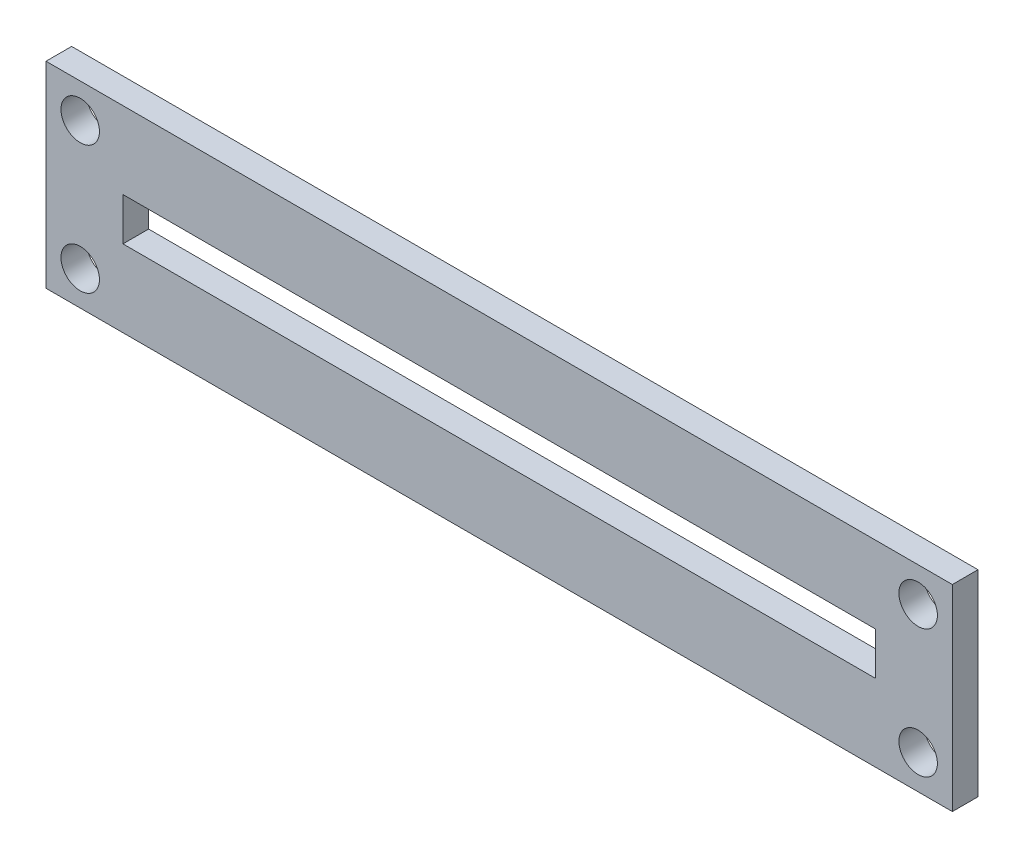
ISO-10303-21;
HEADER;
FILE_DESCRIPTION(('STEP AP214'),'2;1');
FILE_NAME('part.step','',(''),(''),'','','');
FILE_SCHEMA(('AUTOMOTIVE_DESIGN { 1 0 10303 214 1 1 1 1 }'));
ENDSEC;
DATA;
#1=APPLICATION_CONTEXT('core data for automotive mechanical design processes');
#2=APPLICATION_PROTOCOL_DEFINITION('international standard','automotive_design',2000,#1);
#3=PRODUCT_CONTEXT('',#1,'mechanical');
#4=PRODUCT('Part','Part','',(#3));
#5=PRODUCT_RELATED_PRODUCT_CATEGORY('part','',(#4));
#6=PRODUCT_DEFINITION_FORMATION('','',#4);
#7=PRODUCT_DEFINITION_CONTEXT('part definition',#1,'design');
#8=PRODUCT_DEFINITION('design','',#6,#7);
#9=PRODUCT_DEFINITION_SHAPE('','',#8);
#10=(LENGTH_UNIT() NAMED_UNIT(*) SI_UNIT(.MILLI.,.METRE.));
#11=(NAMED_UNIT(*) PLANE_ANGLE_UNIT() SI_UNIT($,.RADIAN.));
#12=(NAMED_UNIT(*) SI_UNIT($,.STERADIAN.) SOLID_ANGLE_UNIT());
#13=UNCERTAINTY_MEASURE_WITH_UNIT(LENGTH_MEASURE(1.E-05),#10,'distance_accuracy_value','');
#14=(GEOMETRIC_REPRESENTATION_CONTEXT(3) GLOBAL_UNCERTAINTY_ASSIGNED_CONTEXT((#13)) GLOBAL_UNIT_ASSIGNED_CONTEXT((#10,
#11,#12)) REPRESENTATION_CONTEXT('',''));
#15=CARTESIAN_POINT('',(0.,0.,0.));
#16=DIRECTION('',(0.,0.,1.));
#17=DIRECTION('',(1.,0.,0.));
#18=AXIS2_PLACEMENT_3D('',#15,#16,#17);
#19=CARTESIAN_POINT('',(0.,0.,3.));
#20=DIRECTION('',(0.,0.,1.));
#21=DIRECTION('',(1.,0.,0.));
#22=AXIS2_PLACEMENT_3D('',#19,#20,#21);
#23=PLANE('',#22);
#24=CARTESIAN_POINT('',(49.,7.5,3.));
#25=DIRECTION('',(0.,0.,1.));
#26=DIRECTION('',(1.,0.,0.));
#27=AXIS2_PLACEMENT_3D('',#24,#25,#26);
#28=CIRCLE('',#27,2.25);
#29=CARTESIAN_POINT('',(51.25,7.5,3.));
#30=VERTEX_POINT('',#29);
#31=EDGE_CURVE('E285',#30,#30,#28,.T.);
#32=ORIENTED_EDGE('',*,*,#31,.F.);
#33=EDGE_LOOP('',(#32));
#34=FACE_BOUND('',#33,.T.);
#35=CARTESIAN_POINT('',(-49.,7.5,3.));
#36=DIRECTION('',(0.,0.,1.));
#37=DIRECTION('',(1.,0.,0.));
#38=AXIS2_PLACEMENT_3D('',#35,#36,#37);
#39=CIRCLE('',#38,2.25);
#40=CARTESIAN_POINT('',(-46.75,7.5,3.));
#41=VERTEX_POINT('',#40);
#42=EDGE_CURVE('E148',#41,#41,#39,.T.);
#43=ORIENTED_EDGE('',*,*,#42,.F.);
#44=EDGE_LOOP('',(#43));
#45=FACE_BOUND('',#44,.T.);
#46=DIRECTION('',(0.,-1.,0.));
#47=VECTOR('',#46,1.);
#48=CARTESIAN_POINT('',(-53.,11.5,3.));
#49=LINE('',#48,#47);
#50=CARTESIAN_POINT('',(-53.,11.5,3.));
#51=VERTEX_POINT('',#50);
#52=CARTESIAN_POINT('',(-53.,-11.5,3.));
#53=VERTEX_POINT('',#52);
#54=EDGE_CURVE('E164',#51,#53,#49,.T.);
#55=ORIENTED_EDGE('',*,*,#54,.T.);
#56=DIRECTION('',(1.,0.,0.));
#57=VECTOR('',#56,1.);
#58=CARTESIAN_POINT('',(-53.,-11.5,3.));
#59=LINE('',#58,#57);
#60=CARTESIAN_POINT('',(53.,-11.5,3.));
#61=VERTEX_POINT('',#60);
#62=EDGE_CURVE('E168',#53,#61,#59,.T.);
#63=ORIENTED_EDGE('',*,*,#62,.T.);
#64=DIRECTION('',(0.,1.,0.));
#65=VECTOR('',#64,1.);
#66=CARTESIAN_POINT('',(53.,11.5,3.));
#67=LINE('',#66,#65);
#68=CARTESIAN_POINT('',(53.,11.5,3.));
#69=VERTEX_POINT('',#68);
#70=EDGE_CURVE('E172',#61,#69,#67,.T.);
#71=ORIENTED_EDGE('',*,*,#70,.T.);
#72=DIRECTION('',(-1.,0.,0.));
#73=VECTOR('',#72,1.);
#74=CARTESIAN_POINT('',(-53.,11.5,3.));
#75=LINE('',#74,#73);
#76=EDGE_CURVE('E175',#69,#51,#75,.T.);
#77=ORIENTED_EDGE('',*,*,#76,.T.);
#78=EDGE_LOOP('',(#55,#63,#71,#77));
#79=FACE_BOUND('',#78,.T.);
#80=DIRECTION('',(0.,-1.,0.));
#81=VECTOR('',#80,1.);
#82=CARTESIAN_POINT('',(-44.,2.50000000000001,3.));
#83=LINE('',#82,#81);
#84=CARTESIAN_POINT('',(-44.,2.50000000000001,3.));
#85=VERTEX_POINT('',#84);
#86=CARTESIAN_POINT('',(-44.,-2.5,3.));
#87=VERTEX_POINT('',#86);
#88=EDGE_CURVE('E122',#85,#87,#83,.T.);
#89=ORIENTED_EDGE('',*,*,#88,.F.);
#90=DIRECTION('',(-1.,0.,0.));
#91=VECTOR('',#90,1.);
#92=CARTESIAN_POINT('',(-44.,2.50000000000001,3.));
#93=LINE('',#92,#91);
#94=CARTESIAN_POINT('',(44.,2.50000000000001,3.));
#95=VERTEX_POINT('',#94);
#96=EDGE_CURVE('E113',#95,#85,#93,.T.);
#97=ORIENTED_EDGE('',*,*,#96,.F.);
#98=DIRECTION('',(0.,1.,0.));
#99=VECTOR('',#98,1.);
#100=CARTESIAN_POINT('',(44.,2.50000000000001,3.));
#101=LINE('',#100,#99);
#102=CARTESIAN_POINT('',(44.,-2.5,3.));
#103=VERTEX_POINT('',#102);
#104=EDGE_CURVE('E140',#103,#95,#101,.T.);
#105=ORIENTED_EDGE('',*,*,#104,.F.);
#106=DIRECTION('',(1.,0.,0.));
#107=VECTOR('',#106,1.);
#108=CARTESIAN_POINT('',(-44.,-2.5,3.));
#109=LINE('',#108,#107);
#110=EDGE_CURVE('E136',#87,#103,#109,.T.);
#111=ORIENTED_EDGE('',*,*,#110,.F.);
#112=EDGE_LOOP('',(#89,#97,#105,#111));
#113=FACE_BOUND('',#112,.T.);
#114=CARTESIAN_POINT('',(-49.,-7.5,3.));
#115=DIRECTION('',(0.,0.,1.));
#116=DIRECTION('',(1.,0.,0.));
#117=AXIS2_PLACEMENT_3D('',#114,#115,#116);
#118=CIRCLE('',#117,2.25);
#119=CARTESIAN_POINT('',(-46.75,-7.5,3.));
#120=VERTEX_POINT('',#119);
#121=EDGE_CURVE('E293',#120,#120,#118,.T.);
#122=ORIENTED_EDGE('',*,*,#121,.F.);
#123=EDGE_LOOP('',(#122));
#124=FACE_BOUND('',#123,.T.);
#125=CARTESIAN_POINT('',(49.,-7.5,3.));
#126=DIRECTION('',(0.,0.,1.));
#127=DIRECTION('',(1.,0.,0.));
#128=AXIS2_PLACEMENT_3D('',#125,#126,#127);
#129=CIRCLE('',#128,2.25);
#130=CARTESIAN_POINT('',(51.25,-7.5,3.));
#131=VERTEX_POINT('',#130);
#132=EDGE_CURVE('E274',#131,#131,#129,.T.);
#133=ORIENTED_EDGE('',*,*,#132,.F.);
#134=EDGE_LOOP('',(#133));
#135=FACE_BOUND('',#134,.T.);
#136=ADVANCED_FACE('F47',(#34,#45,#79,#113,#124,#135),#23,.T.);
#137=CARTESIAN_POINT('',(0.,0.,0.));
#138=DIRECTION('',(0.,0.,1.));
#139=DIRECTION('',(1.,0.,0.));
#140=AXIS2_PLACEMENT_3D('',#137,#138,#139);
#141=PLANE('',#140);
#142=DIRECTION('',(0.,-1.,0.));
#143=VECTOR('',#142,1.);
#144=CARTESIAN_POINT('',(-53.,11.5,0.));
#145=LINE('',#144,#143);
#146=CARTESIAN_POINT('',(-53.,11.5,0.));
#147=VERTEX_POINT('',#146);
#148=CARTESIAN_POINT('',(-53.,-11.5,0.));
#149=VERTEX_POINT('',#148);
#150=EDGE_CURVE('E131',#147,#149,#145,.T.);
#151=ORIENTED_EDGE('',*,*,#150,.F.);
#152=DIRECTION('',(-1.,0.,0.));
#153=VECTOR('',#152,1.);
#154=CARTESIAN_POINT('',(-53.,11.5,0.));
#155=LINE('',#154,#153);
#156=CARTESIAN_POINT('',(53.,11.5,0.));
#157=VERTEX_POINT('',#156);
#158=EDGE_CURVE('E169',#157,#147,#155,.T.);
#159=ORIENTED_EDGE('',*,*,#158,.F.);
#160=DIRECTION('',(0.,1.,0.));
#161=VECTOR('',#160,1.);
#162=CARTESIAN_POINT('',(53.,11.5,0.));
#163=LINE('',#162,#161);
#164=CARTESIAN_POINT('',(53.,-11.5,0.));
#165=VERTEX_POINT('',#164);
#166=EDGE_CURVE('E185',#165,#157,#163,.T.);
#167=ORIENTED_EDGE('',*,*,#166,.F.);
#168=DIRECTION('',(1.,0.,0.));
#169=VECTOR('',#168,1.);
#170=CARTESIAN_POINT('',(-53.,-11.5,0.));
#171=LINE('',#170,#169);
#172=EDGE_CURVE('E182',#149,#165,#171,.T.);
#173=ORIENTED_EDGE('',*,*,#172,.F.);
#174=EDGE_LOOP('',(#151,#159,#167,#173));
#175=FACE_BOUND('',#174,.T.);
#176=DIRECTION('',(-1.,0.,0.));
#177=VECTOR('',#176,1.);
#178=CARTESIAN_POINT('',(-44.,2.50000000000001,0.));
#179=LINE('',#178,#177);
#180=CARTESIAN_POINT('',(44.,2.50000000000001,0.));
#181=VERTEX_POINT('',#180);
#182=CARTESIAN_POINT('',(-44.,2.50000000000001,0.));
#183=VERTEX_POINT('',#182);
#184=EDGE_CURVE('E71',#181,#183,#179,.T.);
#185=ORIENTED_EDGE('',*,*,#184,.T.);
#186=DIRECTION('',(0.,-1.,0.));
#187=VECTOR('',#186,1.);
#188=CARTESIAN_POINT('',(-44.,2.50000000000001,0.));
#189=LINE('',#188,#187);
#190=CARTESIAN_POINT('',(-44.,-2.5,0.));
#191=VERTEX_POINT('',#190);
#192=EDGE_CURVE('E129',#183,#191,#189,.T.);
#193=ORIENTED_EDGE('',*,*,#192,.T.);
#194=DIRECTION('',(1.,0.,0.));
#195=VECTOR('',#194,1.);
#196=CARTESIAN_POINT('',(-44.,-2.5,0.));
#197=LINE('',#196,#195);
#198=CARTESIAN_POINT('',(44.,-2.5,0.));
#199=VERTEX_POINT('',#198);
#200=EDGE_CURVE('E151',#191,#199,#197,.T.);
#201=ORIENTED_EDGE('',*,*,#200,.T.);
#202=DIRECTION('',(0.,1.,0.));
#203=VECTOR('',#202,1.);
#204=CARTESIAN_POINT('',(44.,2.50000000000001,0.));
#205=LINE('',#204,#203);
#206=EDGE_CURVE('E123',#199,#181,#205,.T.);
#207=ORIENTED_EDGE('',*,*,#206,.T.);
#208=EDGE_LOOP('',(#185,#193,#201,#207));
#209=FACE_BOUND('',#208,.T.);
#210=CARTESIAN_POINT('',(-49.,7.5,0.));
#211=DIRECTION('',(0.,0.,1.));
#212=DIRECTION('',(1.,0.,0.));
#213=AXIS2_PLACEMENT_3D('',#210,#211,#212);
#214=CIRCLE('',#213,2.25);
#215=CARTESIAN_POINT('',(-46.75,7.5,0.));
#216=VERTEX_POINT('',#215);
#217=EDGE_CURVE('E297',#216,#216,#214,.T.);
#218=ORIENTED_EDGE('',*,*,#217,.T.);
#219=EDGE_LOOP('',(#218));
#220=FACE_BOUND('',#219,.T.);
#221=CARTESIAN_POINT('',(-49.,-7.5,0.));
#222=DIRECTION('',(0.,0.,1.));
#223=DIRECTION('',(1.,0.,0.));
#224=AXIS2_PLACEMENT_3D('',#221,#222,#223);
#225=CIRCLE('',#224,2.25);
#226=CARTESIAN_POINT('',(-46.75,-7.5,0.));
#227=VERTEX_POINT('',#226);
#228=EDGE_CURVE('E289',#227,#227,#225,.T.);
#229=ORIENTED_EDGE('',*,*,#228,.T.);
#230=EDGE_LOOP('',(#229));
#231=FACE_BOUND('',#230,.T.);
#232=CARTESIAN_POINT('',(49.,7.5,0.));
#233=DIRECTION('',(0.,0.,1.));
#234=DIRECTION('',(1.,0.,0.));
#235=AXIS2_PLACEMENT_3D('',#232,#233,#234);
#236=CIRCLE('',#235,2.25);
#237=CARTESIAN_POINT('',(51.25,7.5,0.));
#238=VERTEX_POINT('',#237);
#239=EDGE_CURVE('E282',#238,#238,#236,.T.);
#240=ORIENTED_EDGE('',*,*,#239,.T.);
#241=EDGE_LOOP('',(#240));
#242=FACE_BOUND('',#241,.T.);
#243=CARTESIAN_POINT('',(49.,-7.5,0.));
#244=DIRECTION('',(0.,0.,1.));
#245=DIRECTION('',(1.,0.,0.));
#246=AXIS2_PLACEMENT_3D('',#243,#244,#245);
#247=CIRCLE('',#246,2.25);
#248=CARTESIAN_POINT('',(51.25,-7.5,0.));
#249=VERTEX_POINT('',#248);
#250=EDGE_CURVE('E277',#249,#249,#247,.T.);
#251=ORIENTED_EDGE('',*,*,#250,.T.);
#252=EDGE_LOOP('',(#251));
#253=FACE_BOUND('',#252,.T.);
#254=ADVANCED_FACE('F208',(#175,#209,#220,#231,#242,#253),#141,.F.);
#255=CARTESIAN_POINT('',(-53.,11.5,3.));
#256=DIRECTION('',(1.,0.,0.));
#257=DIRECTION('',(0.,0.,-1.));
#258=AXIS2_PLACEMENT_3D('',#255,#256,#257);
#259=PLANE('',#258);
#260=ORIENTED_EDGE('',*,*,#150,.T.);
#261=DIRECTION('',(0.,0.,-1.));
#262=VECTOR('',#261,1.);
#263=CARTESIAN_POINT('',(-53.,-11.5,3.));
#264=LINE('',#263,#262);
#265=EDGE_CURVE('E11',#53,#149,#264,.T.);
#266=ORIENTED_EDGE('',*,*,#265,.F.);
#267=ORIENTED_EDGE('',*,*,#54,.F.);
#268=DIRECTION('',(0.,0.,-1.));
#269=VECTOR('',#268,1.);
#270=CARTESIAN_POINT('',(-53.,11.5,3.));
#271=LINE('',#270,#269);
#272=EDGE_CURVE('E178',#51,#147,#271,.T.);
#273=ORIENTED_EDGE('',*,*,#272,.T.);
#274=EDGE_LOOP('',(#260,#266,#267,#273));
#275=FACE_BOUND('',#274,.T.);
#276=ADVANCED_FACE('F49',(#275),#259,.F.);
#277=CARTESIAN_POINT('',(-53.,-11.5,3.));
#278=DIRECTION('',(0.,1.,0.));
#279=DIRECTION('',(0.,0.,1.));
#280=AXIS2_PLACEMENT_3D('',#277,#278,#279);
#281=PLANE('',#280);
#282=ORIENTED_EDGE('',*,*,#172,.T.);
#283=DIRECTION('',(0.,0.,-1.));
#284=VECTOR('',#283,1.);
#285=CARTESIAN_POINT('',(53.,-11.5,3.));
#286=LINE('',#285,#284);
#287=EDGE_CURVE('E56',#61,#165,#286,.T.);
#288=ORIENTED_EDGE('',*,*,#287,.F.);
#289=ORIENTED_EDGE('',*,*,#62,.F.);
#290=ORIENTED_EDGE('',*,*,#265,.T.);
#291=EDGE_LOOP('',(#282,#288,#289,#290));
#292=FACE_BOUND('',#291,.T.);
#293=ADVANCED_FACE('F218',(#292),#281,.F.);
#294=CARTESIAN_POINT('',(53.,11.5,3.));
#295=DIRECTION('',(-1.,0.,0.));
#296=DIRECTION('',(0.,0.,1.));
#297=AXIS2_PLACEMENT_3D('',#294,#295,#296);
#298=PLANE('',#297);
#299=ORIENTED_EDGE('',*,*,#166,.T.);
#300=DIRECTION('',(0.,0.,-1.));
#301=VECTOR('',#300,1.);
#302=CARTESIAN_POINT('',(53.,11.5,3.));
#303=LINE('',#302,#301);
#304=EDGE_CURVE('E193',#69,#157,#303,.T.);
#305=ORIENTED_EDGE('',*,*,#304,.F.);
#306=ORIENTED_EDGE('',*,*,#70,.F.);
#307=ORIENTED_EDGE('',*,*,#287,.T.);
#308=EDGE_LOOP('',(#299,#305,#306,#307));
#309=FACE_BOUND('',#308,.T.);
#310=ADVANCED_FACE('F202',(#309),#298,.F.);
#311=CARTESIAN_POINT('',(-53.,11.5,3.));
#312=DIRECTION('',(0.,-1.,0.));
#313=DIRECTION('',(0.,0.,-1.));
#314=AXIS2_PLACEMENT_3D('',#311,#312,#313);
#315=PLANE('',#314);
#316=ORIENTED_EDGE('',*,*,#158,.T.);
#317=ORIENTED_EDGE('',*,*,#272,.F.);
#318=ORIENTED_EDGE('',*,*,#76,.F.);
#319=ORIENTED_EDGE('',*,*,#304,.T.);
#320=EDGE_LOOP('',(#316,#317,#318,#319));
#321=FACE_BOUND('',#320,.T.);
#322=ADVANCED_FACE('F212',(#321),#315,.F.);
#323=CARTESIAN_POINT('',(-44.,2.50000000000001,3.));
#324=DIRECTION('',(0.,-1.,0.));
#325=DIRECTION('',(0.,0.,-1.));
#326=AXIS2_PLACEMENT_3D('',#323,#324,#325);
#327=PLANE('',#326);
#328=ORIENTED_EDGE('',*,*,#184,.F.);
#329=DIRECTION('',(0.,0.,-1.));
#330=VECTOR('',#329,1.);
#331=CARTESIAN_POINT('',(44.,2.50000000000001,3.));
#332=LINE('',#331,#330);
#333=EDGE_CURVE('E117',#95,#181,#332,.T.);
#334=ORIENTED_EDGE('',*,*,#333,.F.);
#335=ORIENTED_EDGE('',*,*,#96,.T.);
#336=DIRECTION('',(0.,0.,-1.));
#337=VECTOR('',#336,1.);
#338=CARTESIAN_POINT('',(-44.,2.50000000000001,3.));
#339=LINE('',#338,#337);
#340=EDGE_CURVE('E116',#85,#183,#339,.T.);
#341=ORIENTED_EDGE('',*,*,#340,.T.);
#342=EDGE_LOOP('',(#328,#334,#335,#341));
#343=FACE_BOUND('',#342,.T.);
#344=ADVANCED_FACE('F115',(#343),#327,.T.);
#345=CARTESIAN_POINT('',(-44.,2.50000000000001,3.));
#346=DIRECTION('',(1.,0.,0.));
#347=DIRECTION('',(0.,0.,-1.));
#348=AXIS2_PLACEMENT_3D('',#345,#346,#347);
#349=PLANE('',#348);
#350=ORIENTED_EDGE('',*,*,#192,.F.);
#351=ORIENTED_EDGE('',*,*,#340,.F.);
#352=ORIENTED_EDGE('',*,*,#88,.T.);
#353=DIRECTION('',(0.,0.,-1.));
#354=VECTOR('',#353,1.);
#355=CARTESIAN_POINT('',(-44.,-2.5,3.));
#356=LINE('',#355,#354);
#357=EDGE_CURVE('E132',#87,#191,#356,.T.);
#358=ORIENTED_EDGE('',*,*,#357,.T.);
#359=EDGE_LOOP('',(#350,#351,#352,#358));
#360=FACE_BOUND('',#359,.T.);
#361=ADVANCED_FACE('F126',(#360),#349,.T.);
#362=CARTESIAN_POINT('',(-44.,-2.5,3.));
#363=DIRECTION('',(0.,1.,0.));
#364=DIRECTION('',(0.,0.,1.));
#365=AXIS2_PLACEMENT_3D('',#362,#363,#364);
#366=PLANE('',#365);
#367=ORIENTED_EDGE('',*,*,#200,.F.);
#368=ORIENTED_EDGE('',*,*,#357,.F.);
#369=ORIENTED_EDGE('',*,*,#110,.T.);
#370=DIRECTION('',(0.,0.,-1.));
#371=VECTOR('',#370,1.);
#372=CARTESIAN_POINT('',(44.,-2.5,3.));
#373=LINE('',#372,#371);
#374=EDGE_CURVE('E63',#103,#199,#373,.T.);
#375=ORIENTED_EDGE('',*,*,#374,.T.);
#376=EDGE_LOOP('',(#367,#368,#369,#375));
#377=FACE_BOUND('',#376,.T.);
#378=ADVANCED_FACE('F244',(#377),#366,.T.);
#379=CARTESIAN_POINT('',(44.,2.50000000000001,3.));
#380=DIRECTION('',(-1.,0.,0.));
#381=DIRECTION('',(0.,-1.,0.));
#382=AXIS2_PLACEMENT_3D('',#379,#380,#381);
#383=PLANE('',#382);
#384=ORIENTED_EDGE('',*,*,#206,.F.);
#385=ORIENTED_EDGE('',*,*,#374,.F.);
#386=ORIENTED_EDGE('',*,*,#104,.T.);
#387=ORIENTED_EDGE('',*,*,#333,.T.);
#388=EDGE_LOOP('',(#384,#385,#386,#387));
#389=FACE_BOUND('',#388,.T.);
#390=ADVANCED_FACE('F248',(#389),#383,.T.);
#391=CARTESIAN_POINT('',(-49.,7.5,3.));
#392=DIRECTION('',(0.,0.,-1.));
#393=DIRECTION('',(-1.,0.,0.));
#394=AXIS2_PLACEMENT_3D('',#391,#392,#393);
#395=CYLINDRICAL_SURFACE('',#394,2.25);
#396=ORIENTED_EDGE('',*,*,#42,.T.);
#397=EDGE_LOOP('',(#396));
#398=FACE_BOUND('',#397,.T.);
#399=ORIENTED_EDGE('',*,*,#217,.F.);
#400=EDGE_LOOP('',(#399));
#401=FACE_BOUND('',#400,.T.);
#402=ADVANCED_FACE('F254',(#398,#401),#395,.F.);
#403=CARTESIAN_POINT('',(-49.,-7.5,3.));
#404=DIRECTION('',(0.,0.,-1.));
#405=DIRECTION('',(-1.,0.,0.));
#406=AXIS2_PLACEMENT_3D('',#403,#404,#405);
#407=CYLINDRICAL_SURFACE('',#406,2.25);
#408=ORIENTED_EDGE('',*,*,#121,.T.);
#409=EDGE_LOOP('',(#408));
#410=FACE_BOUND('',#409,.T.);
#411=ORIENTED_EDGE('',*,*,#228,.F.);
#412=EDGE_LOOP('',(#411));
#413=FACE_BOUND('',#412,.T.);
#414=ADVANCED_FACE('F257',(#410,#413),#407,.F.);
#415=CARTESIAN_POINT('',(49.,7.5,3.));
#416=DIRECTION('',(0.,0.,-1.));
#417=DIRECTION('',(-1.,0.,0.));
#418=AXIS2_PLACEMENT_3D('',#415,#416,#417);
#419=CYLINDRICAL_SURFACE('',#418,2.25);
#420=ORIENTED_EDGE('',*,*,#31,.T.);
#421=EDGE_LOOP('',(#420));
#422=FACE_BOUND('',#421,.T.);
#423=ORIENTED_EDGE('',*,*,#239,.F.);
#424=EDGE_LOOP('',(#423));
#425=FACE_BOUND('',#424,.T.);
#426=ADVANCED_FACE('F261',(#422,#425),#419,.F.);
#427=CARTESIAN_POINT('',(49.,-7.5,3.));
#428=DIRECTION('',(0.,0.,-1.));
#429=DIRECTION('',(-1.,0.,0.));
#430=AXIS2_PLACEMENT_3D('',#427,#428,#429);
#431=CYLINDRICAL_SURFACE('',#430,2.25);
#432=ORIENTED_EDGE('',*,*,#132,.T.);
#433=EDGE_LOOP('',(#432));
#434=FACE_BOUND('',#433,.T.);
#435=ORIENTED_EDGE('',*,*,#250,.F.);
#436=EDGE_LOOP('',(#435));
#437=FACE_BOUND('',#436,.T.);
#438=ADVANCED_FACE('F265',(#434,#437),#431,.F.);
#439=CLOSED_SHELL('',(#136,#254,#276,#293,#310,#322,#344,#361,#378,#390,#402,#414,#426,#438));
#440=MANIFOLD_SOLID_BREP('B2',#439);
#441=ADVANCED_BREP_SHAPE_REPRESENTATION('',(#18,#440),#14);
#442=SHAPE_DEFINITION_REPRESENTATION(#9,#441);
ENDSEC;
END-ISO-10303-21;
